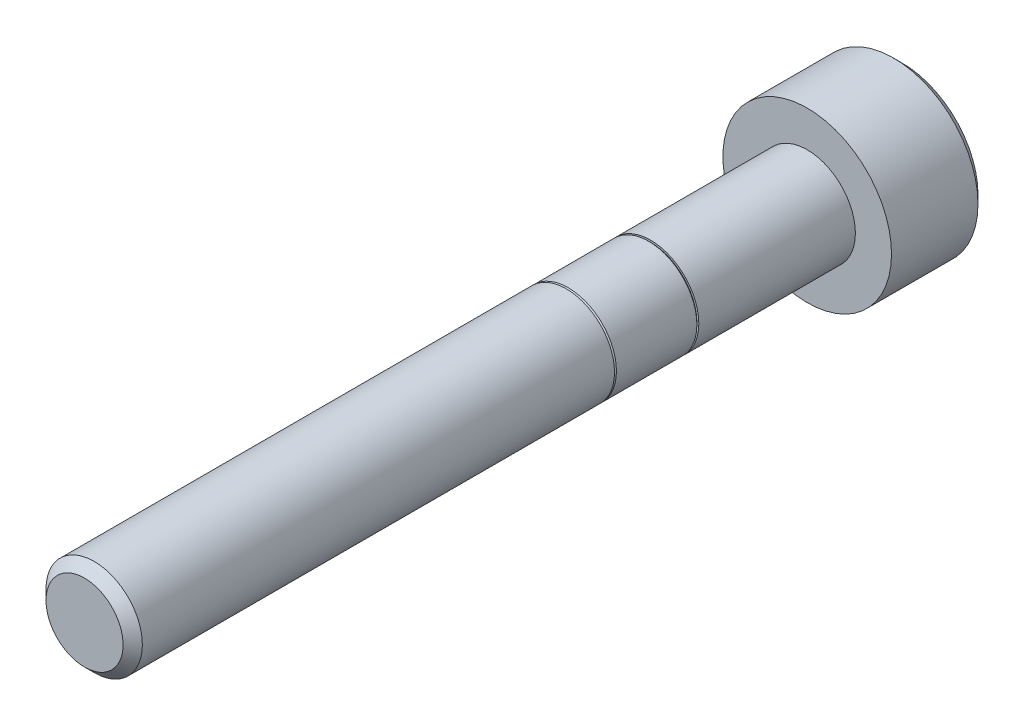
ISO-10303-21;
HEADER;
FILE_DESCRIPTION(('STEP AP214'),'2;1');
FILE_NAME('part.step','',(''),(''),'','','');
FILE_SCHEMA(('AUTOMOTIVE_DESIGN { 1 0 10303 214 1 1 1 1 }'));
ENDSEC;
DATA;
#1=APPLICATION_CONTEXT('core data for automotive mechanical design processes');
#2=APPLICATION_PROTOCOL_DEFINITION('international standard','automotive_design',2000,#1);
#3=PRODUCT_CONTEXT('',#1,'mechanical');
#4=PRODUCT('Part','Part','',(#3));
#5=PRODUCT_RELATED_PRODUCT_CATEGORY('part','',(#4));
#6=PRODUCT_DEFINITION_FORMATION('','',#4);
#7=PRODUCT_DEFINITION_CONTEXT('part definition',#1,'design');
#8=PRODUCT_DEFINITION('design','',#6,#7);
#9=PRODUCT_DEFINITION_SHAPE('','',#8);
#10=(LENGTH_UNIT() NAMED_UNIT(*) SI_UNIT(.MILLI.,.METRE.));
#11=(NAMED_UNIT(*) PLANE_ANGLE_UNIT() SI_UNIT($,.RADIAN.));
#12=(NAMED_UNIT(*) SI_UNIT($,.STERADIAN.) SOLID_ANGLE_UNIT());
#13=UNCERTAINTY_MEASURE_WITH_UNIT(LENGTH_MEASURE(1.E-05),#10,'distance_accuracy_value','');
#14=(GEOMETRIC_REPRESENTATION_CONTEXT(3) GLOBAL_UNCERTAINTY_ASSIGNED_CONTEXT((#13)) GLOBAL_UNIT_ASSIGNED_CONTEXT((#10,
#11,#12)) REPRESENTATION_CONTEXT('',''));
#15=CARTESIAN_POINT('',(0.,0.,0.));
#16=DIRECTION('',(0.,0.,1.));
#17=DIRECTION('',(1.,0.,0.));
#18=AXIS2_PLACEMENT_3D('',#15,#16,#17);
#19=CARTESIAN_POINT('',(0.,1.73205080756888,-3.94));
#20=DIRECTION('',(0.5,0.866025403784439,0.));
#21=DIRECTION('',(-0.866025403784439,0.5,0.));
#22=AXIS2_PLACEMENT_3D('',#19,#20,#21);
#23=PLANE('',#22);
#24=DIRECTION('',(-0.866025403784439,0.5,0.));
#25=VECTOR('',#24,1.);
#26=CARTESIAN_POINT('',(0.,1.73205080756888,-1.94));
#27=LINE('',#26,#25);
#28=CARTESIAN_POINT('',(0.,1.73205080756888,-1.94));
#29=VERTEX_POINT('',#28);
#30=CARTESIAN_POINT('',(1.5,0.86602540378444,-1.94));
#31=VERTEX_POINT('',#30);
#32=EDGE_CURVE('E65',#29,#31,#27,.F.);
#33=ORIENTED_EDGE('',*,*,#32,.F.);
#34=DIRECTION('',(0.,0.,1.));
#35=VECTOR('',#34,1.);
#36=CARTESIAN_POINT('',(0.,1.73205080756888,-3.94));
#37=LINE('',#36,#35);
#38=CARTESIAN_POINT('',(0.,1.73205080756888,-3.94));
#39=VERTEX_POINT('',#38);
#40=EDGE_CURVE('E85',#29,#39,#37,.F.);
#41=ORIENTED_EDGE('',*,*,#40,.T.);
#42=DIRECTION('',(-0.866025403784439,0.5,0.));
#43=VECTOR('',#42,1.);
#44=CARTESIAN_POINT('',(0.,1.73205080756888,-3.94));
#45=LINE('',#44,#43);
#46=CARTESIAN_POINT('',(1.5,0.866025403784439,-3.94));
#47=VERTEX_POINT('',#46);
#48=EDGE_CURVE('E74',#47,#39,#45,.T.);
#49=ORIENTED_EDGE('',*,*,#48,.F.);
#50=DIRECTION('',(0.,0.,-1.));
#51=VECTOR('',#50,1.);
#52=CARTESIAN_POINT('',(1.5,0.866025403784438,-3.94));
#53=LINE('',#52,#51);
#54=EDGE_CURVE('E80',#47,#31,#53,.F.);
#55=ORIENTED_EDGE('',*,*,#54,.T.);
#56=EDGE_LOOP('',(#33,#41,#49,#55));
#57=FACE_BOUND('',#56,.T.);
#58=ADVANCED_FACE('F17',(#57),#23,.F.);
#59=CARTESIAN_POINT('',(1.5,0.866025403784438,-3.94));
#60=DIRECTION('',(1.,0.,0.));
#61=DIRECTION('',(0.,0.,-1.));
#62=AXIS2_PLACEMENT_3D('',#59,#60,#61);
#63=PLANE('',#62);
#64=DIRECTION('',(0.,1.,0.));
#65=VECTOR('',#64,1.);
#66=CARTESIAN_POINT('',(1.5,0.866025403784438,-1.94));
#67=LINE('',#66,#65);
#68=CARTESIAN_POINT('',(1.5,-0.866025403784438,-1.94));
#69=VERTEX_POINT('',#68);
#70=EDGE_CURVE('E89',#31,#69,#67,.F.);
#71=ORIENTED_EDGE('',*,*,#70,.F.);
#72=ORIENTED_EDGE('',*,*,#54,.F.);
#73=DIRECTION('',(0.,1.,0.));
#74=VECTOR('',#73,1.);
#75=CARTESIAN_POINT('',(1.5,0.866025403784438,-3.94));
#76=LINE('',#75,#74);
#77=CARTESIAN_POINT('',(1.5,-0.866025403784438,-3.94));
#78=VERTEX_POINT('',#77);
#79=EDGE_CURVE('E70',#78,#47,#76,.T.);
#80=ORIENTED_EDGE('',*,*,#79,.F.);
#81=DIRECTION('',(0.,0.,1.));
#82=VECTOR('',#81,1.);
#83=CARTESIAN_POINT('',(1.5,-0.866025403784438,-3.94));
#84=LINE('',#83,#82);
#85=EDGE_CURVE('E148',#78,#69,#84,.T.);
#86=ORIENTED_EDGE('',*,*,#85,.T.);
#87=EDGE_LOOP('',(#71,#72,#80,#86));
#88=FACE_BOUND('',#87,.T.);
#89=ADVANCED_FACE('F88',(#88),#63,.F.);
#90=CARTESIAN_POINT('',(-1.5,0.866025403784438,-3.94));
#91=DIRECTION('',(-0.5,0.866025403784439,0.));
#92=DIRECTION('',(-0.866025403784439,-0.5,0.));
#93=AXIS2_PLACEMENT_3D('',#90,#91,#92);
#94=PLANE('',#93);
#95=DIRECTION('',(-0.866025403784438,-0.500000000000001,0.));
#96=VECTOR('',#95,1.);
#97=CARTESIAN_POINT('',(0.,1.73205080756888,-1.94));
#98=LINE('',#97,#96);
#99=CARTESIAN_POINT('',(-1.5,0.866025403784438,-1.94));
#100=VERTEX_POINT('',#99);
#101=EDGE_CURVE('E143',#29,#100,#98,.T.);
#102=ORIENTED_EDGE('',*,*,#101,.T.);
#103=DIRECTION('',(0.,0.,1.));
#104=VECTOR('',#103,1.);
#105=CARTESIAN_POINT('',(-1.5,0.866025403784438,-3.94));
#106=LINE('',#105,#104);
#107=CARTESIAN_POINT('',(-1.5,0.866025403784438,-3.94));
#108=VERTEX_POINT('',#107);
#109=EDGE_CURVE('E135',#100,#108,#106,.F.);
#110=ORIENTED_EDGE('',*,*,#109,.T.);
#111=DIRECTION('',(-0.866025403784439,-0.5,0.));
#112=VECTOR('',#111,1.);
#113=CARTESIAN_POINT('',(-1.5,0.866025403784438,-3.94));
#114=LINE('',#113,#112);
#115=EDGE_CURVE('E91',#39,#108,#114,.T.);
#116=ORIENTED_EDGE('',*,*,#115,.F.);
#117=ORIENTED_EDGE('',*,*,#40,.F.);
#118=EDGE_LOOP('',(#102,#110,#116,#117));
#119=FACE_BOUND('',#118,.T.);
#120=ADVANCED_FACE('F154',(#119),#94,.F.);
#121=CARTESIAN_POINT('',(1.5,-0.866025403784438,-3.94));
#122=DIRECTION('',(0.499999999999999,-0.866025403784439,0.));
#123=DIRECTION('',(0.866025403784439,0.499999999999999,0.));
#124=AXIS2_PLACEMENT_3D('',#121,#122,#123);
#125=PLANE('',#124);
#126=DIRECTION('',(0.866025403784438,0.500000000000001,0.));
#127=VECTOR('',#126,1.);
#128=CARTESIAN_POINT('',(0.,-1.73205080756888,-1.94));
#129=LINE('',#128,#127);
#130=CARTESIAN_POINT('',(0.,-1.73205080756888,-1.94));
#131=VERTEX_POINT('',#130);
#132=EDGE_CURVE('E145',#131,#69,#129,.T.);
#133=ORIENTED_EDGE('',*,*,#132,.T.);
#134=ORIENTED_EDGE('',*,*,#85,.F.);
#135=DIRECTION('',(0.866025403784439,0.499999999999999,0.));
#136=VECTOR('',#135,1.);
#137=CARTESIAN_POINT('',(1.5,-0.866025403784438,-3.94));
#138=LINE('',#137,#136);
#139=CARTESIAN_POINT('',(0.,-1.73205080756888,-3.94));
#140=VERTEX_POINT('',#139);
#141=EDGE_CURVE('E35',#140,#78,#138,.T.);
#142=ORIENTED_EDGE('',*,*,#141,.F.);
#143=DIRECTION('',(0.,0.,1.));
#144=VECTOR('',#143,1.);
#145=CARTESIAN_POINT('',(0.,-1.73205080756888,-3.94));
#146=LINE('',#145,#144);
#147=EDGE_CURVE('E133',#140,#131,#146,.T.);
#148=ORIENTED_EDGE('',*,*,#147,.T.);
#149=EDGE_LOOP('',(#133,#134,#142,#148));
#150=FACE_BOUND('',#149,.T.);
#151=ADVANCED_FACE('F163',(#150),#125,.F.);
#152=CARTESIAN_POINT('',(0.,0.,-1.94));
#153=DIRECTION('',(0.,0.,1.));
#154=DIRECTION('',(1.,0.,0.));
#155=AXIS2_PLACEMENT_3D('',#152,#153,#154);
#156=PLANE('',#155);
#157=ORIENTED_EDGE('',*,*,#32,.T.);
#158=ORIENTED_EDGE('',*,*,#70,.T.);
#159=ORIENTED_EDGE('',*,*,#132,.F.);
#160=DIRECTION('',(0.866025403784438,-0.5,0.));
#161=VECTOR('',#160,1.);
#162=CARTESIAN_POINT('',(0.,-1.73205080756888,-1.94));
#163=LINE('',#162,#161);
#164=CARTESIAN_POINT('',(-1.5,-0.866025403784439,-1.94));
#165=VERTEX_POINT('',#164);
#166=EDGE_CURVE('E131',#131,#165,#163,.F.);
#167=ORIENTED_EDGE('',*,*,#166,.T.);
#168=DIRECTION('',(0.,1.,0.));
#169=VECTOR('',#168,1.);
#170=CARTESIAN_POINT('',(-1.5,-0.866025403784438,-1.94));
#171=LINE('',#170,#169);
#172=EDGE_CURVE('E138',#165,#100,#171,.T.);
#173=ORIENTED_EDGE('',*,*,#172,.T.);
#174=ORIENTED_EDGE('',*,*,#101,.F.);
#175=EDGE_LOOP('',(#157,#158,#159,#167,#173,#174));
#176=FACE_BOUND('',#175,.T.);
#177=ADVANCED_FACE('F164',(#176),#156,.F.);
#178=CARTESIAN_POINT('',(-1.5,-0.866025403784438,-3.94));
#179=DIRECTION('',(-1.,0.,0.));
#180=DIRECTION('',(0.,0.,1.));
#181=AXIS2_PLACEMENT_3D('',#178,#179,#180);
#182=PLANE('',#181);
#183=ORIENTED_EDGE('',*,*,#172,.F.);
#184=DIRECTION('',(0.,0.,1.));
#185=VECTOR('',#184,1.);
#186=CARTESIAN_POINT('',(-1.5,-0.86602540378444,-3.94));
#187=LINE('',#186,#185);
#188=CARTESIAN_POINT('',(-1.5,-0.866025403784439,-3.94));
#189=VERTEX_POINT('',#188);
#190=EDGE_CURVE('E128',#165,#189,#187,.F.);
#191=ORIENTED_EDGE('',*,*,#190,.T.);
#192=DIRECTION('',(0.,1.,0.));
#193=VECTOR('',#192,1.);
#194=CARTESIAN_POINT('',(-1.5,-0.866025403784438,-3.94));
#195=LINE('',#194,#193);
#196=EDGE_CURVE('E141',#108,#189,#195,.F.);
#197=ORIENTED_EDGE('',*,*,#196,.F.);
#198=ORIENTED_EDGE('',*,*,#109,.F.);
#199=EDGE_LOOP('',(#183,#191,#197,#198));
#200=FACE_BOUND('',#199,.T.);
#201=ADVANCED_FACE('F157',(#200),#182,.F.);
#202=CARTESIAN_POINT('',(0.,-1.73205080756888,-3.94));
#203=DIRECTION('',(-0.5,-0.866025403784438,0.));
#204=DIRECTION('',(0.866025403784438,-0.5,0.));
#205=AXIS2_PLACEMENT_3D('',#202,#203,#204);
#206=PLANE('',#205);
#207=ORIENTED_EDGE('',*,*,#166,.F.);
#208=ORIENTED_EDGE('',*,*,#147,.F.);
#209=DIRECTION('',(-0.866025403784438,0.500000000000002,0.));
#210=VECTOR('',#209,1.);
#211=CARTESIAN_POINT('',(0.,-1.73205080756888,-3.94));
#212=LINE('',#211,#210);
#213=EDGE_CURVE('E122',#140,#189,#212,.T.);
#214=ORIENTED_EDGE('',*,*,#213,.T.);
#215=ORIENTED_EDGE('',*,*,#190,.F.);
#216=EDGE_LOOP('',(#207,#208,#214,#215));
#217=FACE_BOUND('',#216,.T.);
#218=ADVANCED_FACE('F161',(#217),#206,.F.);
#219=CARTESIAN_POINT('',(0.,0.,-3.94));
#220=DIRECTION('',(0.,0.,1.));
#221=DIRECTION('',(1.,0.,0.));
#222=AXIS2_PLACEMENT_3D('',#219,#220,#221);
#223=PLANE('',#222);
#224=ORIENTED_EDGE('',*,*,#141,.T.);
#225=ORIENTED_EDGE('',*,*,#79,.T.);
#226=ORIENTED_EDGE('',*,*,#48,.T.);
#227=ORIENTED_EDGE('',*,*,#115,.T.);
#228=ORIENTED_EDGE('',*,*,#196,.T.);
#229=ORIENTED_EDGE('',*,*,#213,.F.);
#230=EDGE_LOOP('',(#224,#225,#226,#227,#228,#229));
#231=FACE_BOUND('',#230,.T.);
#232=CARTESIAN_POINT('',(0.,0.,-3.9400000000569));
#233=DIRECTION('',(0.,0.,1.));
#234=DIRECTION('',(1.,0.,0.));
#235=AXIS2_PLACEMENT_3D('',#232,#233,#234);
#236=CIRCLE('',#235,3.14999999994825);
#237=CARTESIAN_POINT('',(3.14999999994825,0.,-3.9400000000569));
#238=VERTEX_POINT('',#237);
#239=EDGE_CURVE('E20',#238,#238,#236,.T.);
#240=ORIENTED_EDGE('',*,*,#239,.F.);
#241=EDGE_LOOP('',(#240));
#242=FACE_BOUND('',#241,.T.);
#243=ADVANCED_FACE('F72',(#231,#242),#223,.F.);
#244=CARTESIAN_POINT('',(0.,0.,-3.59000000003107));
#245=DIRECTION('',(0.,0.,1.));
#246=DIRECTION('',(1.,0.,0.));
#247=AXIS2_PLACEMENT_3D('',#244,#245,#246);
#248=CONICAL_SURFACE('',#247,3.49999999997408,0.785398163397448);
#249=ORIENTED_EDGE('',*,*,#239,.T.);
#250=EDGE_LOOP('',(#249));
#251=FACE_BOUND('',#250,.T.);
#252=CARTESIAN_POINT('',(0.,0.,-3.59));
#253=DIRECTION('',(0.,0.,1.));
#254=DIRECTION('',(1.,0.,0.));
#255=AXIS2_PLACEMENT_3D('',#252,#253,#254);
#256=CIRCLE('',#255,3.5);
#257=CARTESIAN_POINT('',(3.5,0.,-3.59));
#258=VERTEX_POINT('',#257);
#259=EDGE_CURVE('E114',#258,#258,#256,.T.);
#260=ORIENTED_EDGE('',*,*,#259,.F.);
#261=EDGE_LOOP('',(#260));
#262=FACE_BOUND('',#261,.T.);
#263=ADVANCED_FACE('F221',(#251,#262),#248,.T.);
#264=CARTESIAN_POINT('',(0.,0.,-3.94));
#265=DIRECTION('',(0.,0.,1.));
#266=DIRECTION('',(1.,0.,0.));
#267=AXIS2_PLACEMENT_3D('',#264,#265,#266);
#268=CYLINDRICAL_SURFACE('',#267,3.5);
#269=ORIENTED_EDGE('',*,*,#259,.T.);
#270=EDGE_LOOP('',(#269));
#271=FACE_BOUND('',#270,.T.);
#272=CARTESIAN_POINT('',(0.,0.,0.));
#273=DIRECTION('',(0.,0.,1.));
#274=DIRECTION('',(1.,0.,0.));
#275=AXIS2_PLACEMENT_3D('',#272,#273,#274);
#276=CIRCLE('',#275,3.5);
#277=CARTESIAN_POINT('',(3.5,0.,0.));
#278=VERTEX_POINT('',#277);
#279=EDGE_CURVE('E112',#278,#278,#276,.T.);
#280=ORIENTED_EDGE('',*,*,#279,.F.);
#281=EDGE_LOOP('',(#280));
#282=FACE_BOUND('',#281,.T.);
#283=ADVANCED_FACE('F217',(#271,#282),#268,.T.);
#284=CARTESIAN_POINT('',(0.,0.,0.));
#285=DIRECTION('',(0.,0.,1.));
#286=DIRECTION('',(1.,0.,0.));
#287=AXIS2_PLACEMENT_3D('',#284,#285,#286);
#288=PLANE('',#287);
#289=CARTESIAN_POINT('',(0.,0.,0.));
#290=DIRECTION('',(0.,0.,1.));
#291=DIRECTION('',(1.,0.,0.));
#292=AXIS2_PLACEMENT_3D('',#289,#290,#291);
#293=CIRCLE('',#292,2.);
#294=CARTESIAN_POINT('',(2.,0.,0.));
#295=VERTEX_POINT('',#294);
#296=EDGE_CURVE('E110',#295,#295,#293,.T.);
#297=ORIENTED_EDGE('',*,*,#296,.F.);
#298=EDGE_LOOP('',(#297));
#299=FACE_BOUND('',#298,.T.);
#300=ORIENTED_EDGE('',*,*,#279,.T.);
#301=EDGE_LOOP('',(#300));
#302=FACE_BOUND('',#301,.T.);
#303=ADVANCED_FACE('F213',(#299,#302),#288,.T.);
#304=CARTESIAN_POINT('',(0.,0.,0.));
#305=DIRECTION('',(0.,0.,1.));
#306=DIRECTION('',(1.,0.,0.));
#307=AXIS2_PLACEMENT_3D('',#304,#305,#306);
#308=CYLINDRICAL_SURFACE('',#307,2.);
#309=ORIENTED_EDGE('',*,*,#296,.T.);
#310=EDGE_LOOP('',(#309));
#311=FACE_BOUND('',#310,.T.);
#312=CARTESIAN_POINT('',(0.,0.,6.5));
#313=DIRECTION('',(0.,0.,1.));
#314=DIRECTION('',(1.,0.,0.));
#315=AXIS2_PLACEMENT_3D('',#312,#313,#314);
#316=CIRCLE('',#315,2.);
#317=CARTESIAN_POINT('',(2.,0.,6.5));
#318=VERTEX_POINT('',#317);
#319=EDGE_CURVE('E107',#318,#318,#316,.T.);
#320=ORIENTED_EDGE('',*,*,#319,.F.);
#321=EDGE_LOOP('',(#320));
#322=FACE_BOUND('',#321,.T.);
#323=ADVANCED_FACE('F209',(#311,#322),#308,.T.);
#324=CARTESIAN_POINT('',(0.,0.,6.5));
#325=DIRECTION('',(0.,0.,1.));
#326=DIRECTION('',(1.,0.,0.));
#327=AXIS2_PLACEMENT_3D('',#324,#325,#326);
#328=PLANE('',#327);
#329=CARTESIAN_POINT('',(0.,0.,6.50000000001683));
#330=DIRECTION('',(0.,0.,1.));
#331=DIRECTION('',(0.,-1.,0.));
#332=AXIS2_PLACEMENT_3D('',#329,#330,#331);
#333=CIRCLE('',#332,1.91999999998416);
#334=CARTESIAN_POINT('',(0.,-1.91999999998416,6.50000000001683));
#335=VERTEX_POINT('',#334);
#336=EDGE_CURVE('E103',#335,#335,#333,.T.);
#337=ORIENTED_EDGE('',*,*,#336,.F.);
#338=EDGE_LOOP('',(#337));
#339=FACE_BOUND('',#338,.T.);
#340=ORIENTED_EDGE('',*,*,#319,.T.);
#341=EDGE_LOOP('',(#340));
#342=FACE_BOUND('',#341,.T.);
#343=ADVANCED_FACE('F205',(#339,#342),#328,.T.);
#344=CARTESIAN_POINT('',(0.,0.,6.57999999998538));
#345=DIRECTION('',(0.,0.,1.));
#346=DIRECTION('',(0.,-1.,0.));
#347=AXIS2_PLACEMENT_3D('',#344,#345,#346);
#348=CONICAL_SURFACE('',#347,2.00000000000955,0.78539816375272);
#349=ORIENTED_EDGE('',*,*,#336,.T.);
#350=EDGE_LOOP('',(#349));
#351=FACE_BOUND('',#350,.T.);
#352=CARTESIAN_POINT('',(0.,0.,6.58));
#353=DIRECTION('',(0.,0.,1.));
#354=DIRECTION('',(1.,0.,0.));
#355=AXIS2_PLACEMENT_3D('',#352,#353,#354);
#356=CIRCLE('',#355,2.);
#357=CARTESIAN_POINT('',(2.,0.,6.58));
#358=VERTEX_POINT('',#357);
#359=EDGE_CURVE('E106',#358,#358,#356,.T.);
#360=ORIENTED_EDGE('',*,*,#359,.F.);
#361=EDGE_LOOP('',(#360));
#362=FACE_BOUND('',#361,.T.);
#363=ADVANCED_FACE('F201',(#351,#362),#348,.T.);
#364=CARTESIAN_POINT('',(0.,0.,6.5));
#365=DIRECTION('',(0.,0.,1.));
#366=DIRECTION('',(1.,0.,0.));
#367=AXIS2_PLACEMENT_3D('',#364,#365,#366);
#368=CYLINDRICAL_SURFACE('',#367,2.);
#369=ORIENTED_EDGE('',*,*,#359,.T.);
#370=EDGE_LOOP('',(#369));
#371=FACE_BOUND('',#370,.T.);
#372=CARTESIAN_POINT('',(0.,0.,9.92000000002236));
#373=DIRECTION('',(0.,0.,-1.));
#374=DIRECTION('',(-1.,0.,0.));
#375=AXIS2_PLACEMENT_3D('',#372,#373,#374);
#376=CIRCLE('',#375,1.99999999995271);
#377=CARTESIAN_POINT('',(-1.99999999995271,0.,9.92000000002236));
#378=VERTEX_POINT('',#377);
#379=EDGE_CURVE('E102',#378,#378,#376,.F.);
#380=ORIENTED_EDGE('',*,*,#379,.F.);
#381=EDGE_LOOP('',(#380));
#382=FACE_BOUND('',#381,.T.);
#383=ADVANCED_FACE('F197',(#371,#382),#368,.T.);
#384=CARTESIAN_POINT('',(0.,0.,30.));
#385=DIRECTION('',(0.,0.,1.));
#386=DIRECTION('',(1.,0.,0.));
#387=AXIS2_PLACEMENT_3D('',#384,#385,#386);
#388=PLANE('',#387);
#389=CARTESIAN_POINT('',(0.,0.,29.9999999999727));
#390=DIRECTION('',(0.,0.,-1.));
#391=DIRECTION('',(-1.,0.,0.));
#392=AXIS2_PLACEMENT_3D('',#389,#390,#391);
#393=CIRCLE('',#392,1.59999999993943);
#394=CARTESIAN_POINT('',(-1.59999999993943,0.,29.9999999999727));
#395=VERTEX_POINT('',#394);
#396=EDGE_CURVE('E99',#395,#395,#393,.T.);
#397=ORIENTED_EDGE('',*,*,#396,.F.);
#398=EDGE_LOOP('',(#397));
#399=FACE_BOUND('',#398,.T.);
#400=ADVANCED_FACE('F193',(#399),#388,.T.);
#401=CARTESIAN_POINT('',(0.,0.,9.92000000002236));
#402=DIRECTION('',(0.,0.,-1.));
#403=DIRECTION('',(-1.,0.,0.));
#404=AXIS2_PLACEMENT_3D('',#401,#402,#403);
#405=CONICAL_SURFACE('',#404,1.99999999995271,0.785398163397448);
#406=ORIENTED_EDGE('',*,*,#379,.T.);
#407=EDGE_LOOP('',(#406));
#408=FACE_BOUND('',#407,.T.);
#409=CARTESIAN_POINT('',(0.,0.,9.99999999999091));
#410=DIRECTION('',(0.,0.,-1.));
#411=DIRECTION('',(-1.,0.,0.));
#412=AXIS2_PLACEMENT_3D('',#409,#410,#411);
#413=CIRCLE('',#412,1.91999999998416);
#414=CARTESIAN_POINT('',(-1.91999999998416,0.,9.99999999999091));
#415=VERTEX_POINT('',#414);
#416=EDGE_CURVE('E96',#415,#415,#413,.T.);
#417=ORIENTED_EDGE('',*,*,#416,.T.);
#418=EDGE_LOOP('',(#417));
#419=FACE_BOUND('',#418,.T.);
#420=ADVANCED_FACE('F189',(#408,#419),#405,.T.);
#421=CARTESIAN_POINT('',(0.,0.,29.6000000000731));
#422=DIRECTION('',(0.,0.,-1.));
#423=DIRECTION('',(-1.,0.,0.));
#424=AXIS2_PLACEMENT_3D('',#421,#422,#423);
#425=CONICAL_SURFACE('',#424,1.99999999983902,0.785398163397448);
#426=CARTESIAN_POINT('',(0.,0.,29.6));
#427=DIRECTION('',(0.,0.,1.));
#428=DIRECTION('',(1.,0.,0.));
#429=AXIS2_PLACEMENT_3D('',#426,#427,#428);
#430=CIRCLE('',#429,2.);
#431=CARTESIAN_POINT('',(2.,0.,29.6));
#432=VERTEX_POINT('',#431);
#433=EDGE_CURVE('E26',#432,#432,#430,.F.);
#434=ORIENTED_EDGE('',*,*,#433,.F.);
#435=EDGE_LOOP('',(#434));
#436=FACE_BOUND('',#435,.T.);
#437=ORIENTED_EDGE('',*,*,#396,.T.);
#438=EDGE_LOOP('',(#437));
#439=FACE_BOUND('',#438,.T.);
#440=ADVANCED_FACE('F182',(#436,#439),#425,.T.);
#441=CARTESIAN_POINT('',(0.,0.,10.));
#442=DIRECTION('',(0.,0.,1.));
#443=DIRECTION('',(1.,0.,0.));
#444=AXIS2_PLACEMENT_3D('',#441,#442,#443);
#445=PLANE('',#444);
#446=ORIENTED_EDGE('',*,*,#416,.F.);
#447=EDGE_LOOP('',(#446));
#448=FACE_BOUND('',#447,.T.);
#449=CARTESIAN_POINT('',(0.,0.,10.));
#450=DIRECTION('',(0.,0.,1.));
#451=DIRECTION('',(1.,0.,0.));
#452=AXIS2_PLACEMENT_3D('',#449,#450,#451);
#453=CIRCLE('',#452,2.);
#454=CARTESIAN_POINT('',(2.,0.,10.));
#455=VERTEX_POINT('',#454);
#456=EDGE_CURVE('E11',#455,#455,#453,.T.);
#457=ORIENTED_EDGE('',*,*,#456,.F.);
#458=EDGE_LOOP('',(#457));
#459=FACE_BOUND('',#458,.T.);
#460=ADVANCED_FACE('F176',(#448,#459),#445,.F.);
#461=CARTESIAN_POINT('',(0.,0.,10.));
#462=DIRECTION('',(0.,0.,1.));
#463=DIRECTION('',(1.,0.,0.));
#464=AXIS2_PLACEMENT_3D('',#461,#462,#463);
#465=CYLINDRICAL_SURFACE('',#464,2.);
#466=ORIENTED_EDGE('',*,*,#456,.T.);
#467=EDGE_LOOP('',(#466));
#468=FACE_BOUND('',#467,.T.);
#469=ORIENTED_EDGE('',*,*,#433,.T.);
#470=EDGE_LOOP('',(#469));
#471=FACE_BOUND('',#470,.T.);
#472=ADVANCED_FACE('F174',(#468,#471),#465,.T.);
#473=CLOSED_SHELL('',(#58,#89,#120,#151,#177,#201,#218,#243,#263,#283,#303,#323,#343,#363,#383,
#400,#420,#440,#460,#472));
#474=MANIFOLD_SOLID_BREP('B1',#473);
#475=ADVANCED_BREP_SHAPE_REPRESENTATION('',(#18,#474),#14);
#476=SHAPE_DEFINITION_REPRESENTATION(#9,#475);
ENDSEC;
END-ISO-10303-21;
